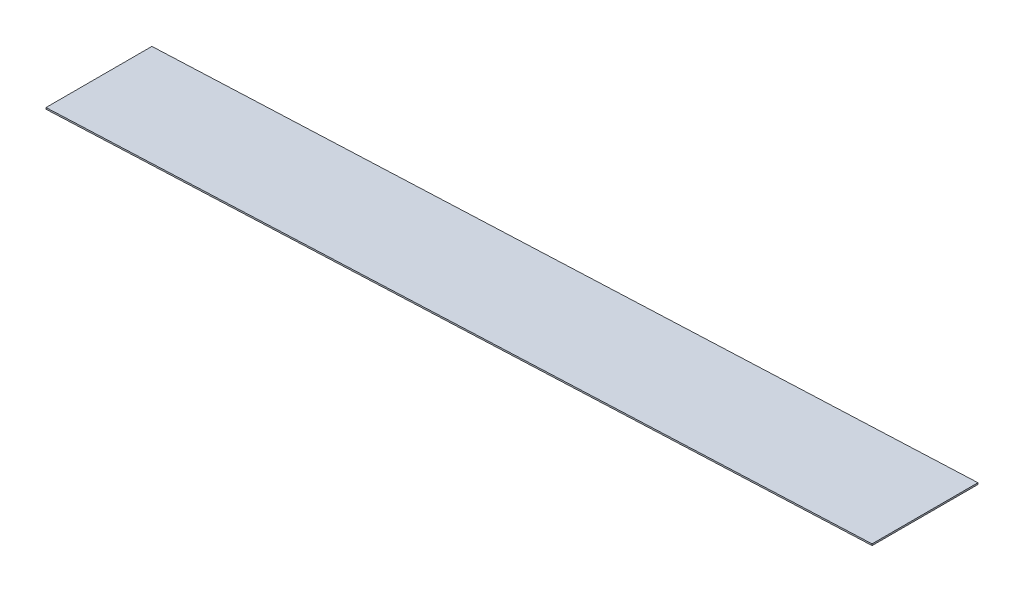
ISO-10303-21;
HEADER;
FILE_DESCRIPTION(('STEP AP214'),'2;1');
FILE_NAME('part.step','',(''),(''),'','','');
FILE_SCHEMA(('AUTOMOTIVE_DESIGN { 1 0 10303 214 1 1 1 1 }'));
ENDSEC;
DATA;
#1=APPLICATION_CONTEXT('core data for automotive mechanical design processes');
#2=APPLICATION_PROTOCOL_DEFINITION('international standard','automotive_design',2000,#1);
#3=PRODUCT_CONTEXT('',#1,'mechanical');
#4=PRODUCT('Part','Part','',(#3));
#5=PRODUCT_RELATED_PRODUCT_CATEGORY('part','',(#4));
#6=PRODUCT_DEFINITION_FORMATION('','',#4);
#7=PRODUCT_DEFINITION_CONTEXT('part definition',#1,'design');
#8=PRODUCT_DEFINITION('design','',#6,#7);
#9=PRODUCT_DEFINITION_SHAPE('','',#8);
#10=(LENGTH_UNIT() NAMED_UNIT(*) SI_UNIT(.MILLI.,.METRE.));
#11=(NAMED_UNIT(*) PLANE_ANGLE_UNIT() SI_UNIT($,.RADIAN.));
#12=(NAMED_UNIT(*) SI_UNIT($,.STERADIAN.) SOLID_ANGLE_UNIT());
#13=UNCERTAINTY_MEASURE_WITH_UNIT(LENGTH_MEASURE(1.E-05),#10,'distance_accuracy_value','');
#14=(GEOMETRIC_REPRESENTATION_CONTEXT(3) GLOBAL_UNCERTAINTY_ASSIGNED_CONTEXT((#13)) GLOBAL_UNIT_ASSIGNED_CONTEXT((#10,
#11,#12)) REPRESENTATION_CONTEXT('',''));
#15=CARTESIAN_POINT('',(0.,0.,0.));
#16=DIRECTION('',(0.,0.,1.));
#17=DIRECTION('',(1.,0.,0.));
#18=AXIS2_PLACEMENT_3D('',#15,#16,#17);
#19=CARTESIAN_POINT('',(-7.39628293963734,173.84273064663,-60.));
#20=DIRECTION('',(0.999096153141553,0.0425073732163067,0.));
#21=DIRECTION('',(0.,0.,1.));
#22=AXIS2_PLACEMENT_3D('',#19,#20,#21);
#23=PLANE('',#22);
#24=DIRECTION('',(0.0425073732163067,-0.999096153141553,0.));
#25=VECTOR('',#24,1.);
#26=CARTESIAN_POINT('',(-7.39628293963734,173.84273064663,10.));
#27=LINE('',#26,#25);
#28=CARTESIAN_POINT('',(-7.43879031285366,174.841826799772,10.0000000000001));
#29=VERTEX_POINT('',#28);
#30=CARTESIAN_POINT('',(-7.35377556642103,172.843634493489,10.0000000000001));
#31=VERTEX_POINT('',#30);
#32=EDGE_CURVE('E12',#29,#31,#27,.T.);
#33=ORIENTED_EDGE('',*,*,#32,.F.);
#34=DIRECTION('',(0.,0.,1.));
#35=VECTOR('',#34,1.);
#36=CARTESIAN_POINT('',(-7.43879031285366,174.841826799772,-60.));
#37=LINE('',#36,#35);
#38=CARTESIAN_POINT('',(-7.43879031285366,174.841826799772,-130.));
#39=VERTEX_POINT('',#38);
#40=EDGE_CURVE('E81',#29,#39,#37,.F.);
#41=ORIENTED_EDGE('',*,*,#40,.T.);
#42=DIRECTION('',(0.0425073732163067,-0.999096153141553,0.));
#43=VECTOR('',#42,1.);
#44=CARTESIAN_POINT('',(-7.39628293963734,173.84273064663,-130.));
#45=LINE('',#44,#43);
#46=CARTESIAN_POINT('',(-7.35377556642103,172.843634493489,-130.));
#47=VERTEX_POINT('',#46);
#48=EDGE_CURVE('E53',#39,#47,#45,.T.);
#49=ORIENTED_EDGE('',*,*,#48,.T.);
#50=DIRECTION('',(0.,0.,1.));
#51=VECTOR('',#50,1.);
#52=CARTESIAN_POINT('',(-7.35377556642103,172.843634493489,-60.));
#53=LINE('',#52,#51);
#54=EDGE_CURVE('E83',#31,#47,#53,.F.);
#55=ORIENTED_EDGE('',*,*,#54,.F.);
#56=EDGE_LOOP('',(#33,#41,#49,#55));
#57=FACE_BOUND('',#56,.T.);
#58=ADVANCED_FACE('F43',(#57),#23,.F.);
#59=CARTESIAN_POINT('',(538.696472900707,197.076699179325,-130.));
#60=DIRECTION('',(0.,0.,-1.));
#61=DIRECTION('',(0.999096153141553,0.0425073732163067,0.));
#62=AXIS2_PLACEMENT_3D('',#59,#60,#61);
#63=PLANE('',#62);
#64=ORIENTED_EDGE('',*,*,#48,.F.);
#65=DIRECTION('',(0.999096153141553,0.0425073732163067,0.));
#66=VECTOR('',#65,1.);
#67=CARTESIAN_POINT('',(538.653965527491,198.075795332466,-130.));
#68=LINE('',#67,#66);
#69=CARTESIAN_POINT('',(1084.74672136783,221.309763865161,-130.));
#70=VERTEX_POINT('',#69);
#71=EDGE_CURVE('E95',#39,#70,#68,.T.);
#72=ORIENTED_EDGE('',*,*,#71,.T.);
#73=DIRECTION('',(0.0425073732163067,-0.999096153141553,0.));
#74=VECTOR('',#73,1.);
#75=CARTESIAN_POINT('',(1084.78922874105,220.310667712019,-130.));
#76=LINE('',#75,#74);
#77=CARTESIAN_POINT('',(1084.83173611427,219.311571558878,-130.));
#78=VERTEX_POINT('',#77);
#79=EDGE_CURVE('E104',#70,#78,#76,.T.);
#80=ORIENTED_EDGE('',*,*,#79,.T.);
#81=DIRECTION('',(0.999096153141553,0.0425073732163067,0.));
#82=VECTOR('',#81,1.);
#83=CARTESIAN_POINT('',(538.738980273924,196.077603026183,-130.));
#84=LINE('',#83,#82);
#85=EDGE_CURVE('E99',#47,#78,#84,.T.);
#86=ORIENTED_EDGE('',*,*,#85,.F.);
#87=EDGE_LOOP('',(#64,#72,#80,#86));
#88=FACE_BOUND('',#87,.T.);
#89=ADVANCED_FACE('F112',(#88),#63,.T.);
#90=CARTESIAN_POINT('',(1084.78922874105,220.310667712019,-60.));
#91=DIRECTION('',(0.999096153141553,0.0425073732163067,0.));
#92=DIRECTION('',(0.,0.,1.));
#93=AXIS2_PLACEMENT_3D('',#90,#91,#92);
#94=PLANE('',#93);
#95=ORIENTED_EDGE('',*,*,#79,.F.);
#96=DIRECTION('',(0.,0.,1.));
#97=VECTOR('',#96,1.);
#98=CARTESIAN_POINT('',(1084.74672136783,221.309763865161,-60.));
#99=LINE('',#98,#97);
#100=CARTESIAN_POINT('',(1084.74672136783,221.309763865161,10.0000000000001));
#101=VERTEX_POINT('',#100);
#102=EDGE_CURVE('E97',#70,#101,#99,.T.);
#103=ORIENTED_EDGE('',*,*,#102,.T.);
#104=DIRECTION('',(0.0425073732163067,-0.999096153141553,0.));
#105=VECTOR('',#104,1.);
#106=CARTESIAN_POINT('',(1084.78922874105,220.310667712019,10.));
#107=LINE('',#106,#105);
#108=CARTESIAN_POINT('',(1084.83173611427,219.311571558878,10.0000000000001));
#109=VERTEX_POINT('',#108);
#110=EDGE_CURVE('E47',#101,#109,#107,.T.);
#111=ORIENTED_EDGE('',*,*,#110,.T.);
#112=DIRECTION('',(0.,0.,1.));
#113=VECTOR('',#112,1.);
#114=CARTESIAN_POINT('',(1084.83173611427,219.311571558878,-60.));
#115=LINE('',#114,#113);
#116=EDGE_CURVE('E113',#78,#109,#115,.T.);
#117=ORIENTED_EDGE('',*,*,#116,.F.);
#118=EDGE_LOOP('',(#95,#103,#111,#117));
#119=FACE_BOUND('',#118,.T.);
#120=ADVANCED_FACE('F117',(#119),#94,.T.);
#121=CARTESIAN_POINT('',(538.696472900707,197.076699179325,10.));
#122=DIRECTION('',(0.,0.,-1.));
#123=DIRECTION('',(0.999096153141553,0.0425073732163067,0.));
#124=AXIS2_PLACEMENT_3D('',#121,#122,#123);
#125=PLANE('',#124);
#126=DIRECTION('',(0.999096153141553,0.0425073732163067,0.));
#127=VECTOR('',#126,1.);
#128=CARTESIAN_POINT('',(538.653965527491,198.075795332466,10.0000000000001));
#129=LINE('',#128,#127);
#130=EDGE_CURVE('E93',#101,#29,#129,.F.);
#131=ORIENTED_EDGE('',*,*,#130,.T.);
#132=ORIENTED_EDGE('',*,*,#32,.T.);
#133=DIRECTION('',(0.999096153141553,0.0425073732163067,0.));
#134=VECTOR('',#133,1.);
#135=CARTESIAN_POINT('',(538.738980273924,196.077603026183,10.0000000000001));
#136=LINE('',#135,#134);
#137=EDGE_CURVE('E111',#109,#31,#136,.F.);
#138=ORIENTED_EDGE('',*,*,#137,.F.);
#139=ORIENTED_EDGE('',*,*,#110,.F.);
#140=EDGE_LOOP('',(#131,#132,#138,#139));
#141=FACE_BOUND('',#140,.T.);
#142=ADVANCED_FACE('F45',(#141),#125,.F.);
#143=CARTESIAN_POINT('',(538.738980273924,196.077603026183,-60.));
#144=DIRECTION('',(0.0425073732163067,-0.999096153141553,0.));
#145=DIRECTION('',(0.999096153141553,0.0425073732163067,0.));
#146=AXIS2_PLACEMENT_3D('',#143,#144,#145);
#147=PLANE('',#146);
#148=ORIENTED_EDGE('',*,*,#116,.T.);
#149=ORIENTED_EDGE('',*,*,#137,.T.);
#150=ORIENTED_EDGE('',*,*,#54,.T.);
#151=ORIENTED_EDGE('',*,*,#85,.T.);
#152=EDGE_LOOP('',(#148,#149,#150,#151));
#153=FACE_BOUND('',#152,.T.);
#154=ADVANCED_FACE('F110',(#153),#147,.T.);
#155=CARTESIAN_POINT('',(538.653965527491,198.075795332466,-60.));
#156=DIRECTION('',(0.0425073732163067,-0.999096153141553,0.));
#157=DIRECTION('',(0.999096153141553,0.0425073732163067,0.));
#158=AXIS2_PLACEMENT_3D('',#155,#156,#157);
#159=PLANE('',#158);
#160=ORIENTED_EDGE('',*,*,#102,.F.);
#161=ORIENTED_EDGE('',*,*,#71,.F.);
#162=ORIENTED_EDGE('',*,*,#40,.F.);
#163=ORIENTED_EDGE('',*,*,#130,.F.);
#164=EDGE_LOOP('',(#160,#161,#162,#163));
#165=FACE_BOUND('',#164,.T.);
#166=ADVANCED_FACE('F92',(#165),#159,.F.);
#167=CLOSED_SHELL('',(#58,#89,#120,#142,#154,#166));
#168=MANIFOLD_SOLID_BREP('B2',#167);
#169=ADVANCED_BREP_SHAPE_REPRESENTATION('',(#18,#168),#14);
#170=SHAPE_DEFINITION_REPRESENTATION(#9,#169);
ENDSEC;
END-ISO-10303-21;
